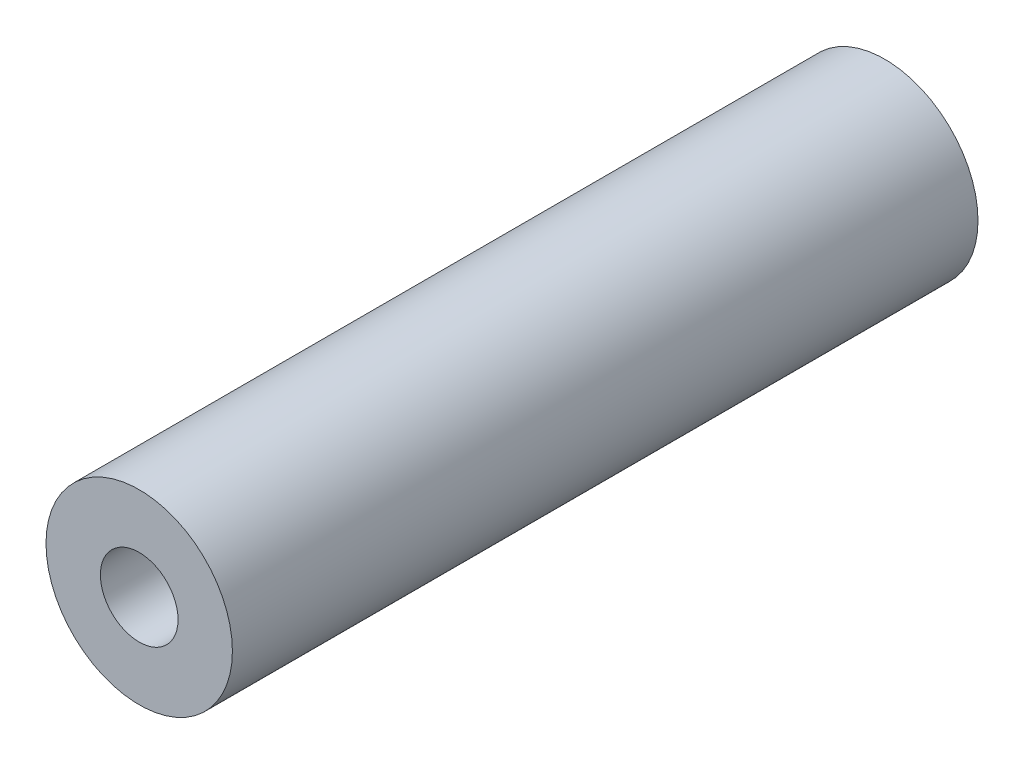
ISO-10303-21;
HEADER;
FILE_DESCRIPTION(('STEP AP214'),'2;1');
FILE_NAME('part.step','',(''),(''),'','','');
FILE_SCHEMA(('AUTOMOTIVE_DESIGN { 1 0 10303 214 1 1 1 1 }'));
ENDSEC;
DATA;
#1=APPLICATION_CONTEXT('core data for automotive mechanical design processes');
#2=APPLICATION_PROTOCOL_DEFINITION('international standard','automotive_design',2000,#1);
#3=PRODUCT_CONTEXT('',#1,'mechanical');
#4=PRODUCT('Part','Part','',(#3));
#5=PRODUCT_RELATED_PRODUCT_CATEGORY('part','',(#4));
#6=PRODUCT_DEFINITION_FORMATION('','',#4);
#7=PRODUCT_DEFINITION_CONTEXT('part definition',#1,'design');
#8=PRODUCT_DEFINITION('design','',#6,#7);
#9=PRODUCT_DEFINITION_SHAPE('','',#8);
#10=(LENGTH_UNIT() NAMED_UNIT(*) SI_UNIT(.MILLI.,.METRE.));
#11=(NAMED_UNIT(*) PLANE_ANGLE_UNIT() SI_UNIT($,.RADIAN.));
#12=(NAMED_UNIT(*) SI_UNIT($,.STERADIAN.) SOLID_ANGLE_UNIT());
#13=UNCERTAINTY_MEASURE_WITH_UNIT(LENGTH_MEASURE(1.E-05),#10,'distance_accuracy_value','');
#14=(GEOMETRIC_REPRESENTATION_CONTEXT(3) GLOBAL_UNCERTAINTY_ASSIGNED_CONTEXT((#13)) GLOBAL_UNIT_ASSIGNED_CONTEXT((#10,
#11,#12)) REPRESENTATION_CONTEXT('',''));
#15=CARTESIAN_POINT('',(0.,0.,0.));
#16=DIRECTION('',(0.,0.,1.));
#17=DIRECTION('',(1.,0.,0.));
#18=AXIS2_PLACEMENT_3D('',#15,#16,#17);
#19=CARTESIAN_POINT('',(0.,0.,24.));
#20=DIRECTION('',(0.,0.,1.));
#21=DIRECTION('',(1.,0.,0.));
#22=AXIS2_PLACEMENT_3D('',#19,#20,#21);
#23=PLANE('',#22);
#24=CARTESIAN_POINT('',(0.,0.,24.));
#25=DIRECTION('',(0.,0.,1.));
#26=DIRECTION('',(1.,0.,0.));
#27=AXIS2_PLACEMENT_3D('',#24,#25,#26);
#28=CIRCLE('',#27,3.);
#29=CARTESIAN_POINT('',(3.,0.,24.));
#30=VERTEX_POINT('',#29);
#31=EDGE_CURVE('E10',#30,#30,#28,.T.);
#32=ORIENTED_EDGE('',*,*,#31,.T.);
#33=EDGE_LOOP('',(#32));
#34=FACE_BOUND('',#33,.T.);
#35=CARTESIAN_POINT('',(0.,0.,24.));
#36=DIRECTION('',(0.,0.,1.));
#37=DIRECTION('',(1.,0.,0.));
#38=AXIS2_PLACEMENT_3D('',#35,#36,#37);
#39=CIRCLE('',#38,1.25);
#40=CARTESIAN_POINT('',(1.25,0.,24.));
#41=VERTEX_POINT('',#40);
#42=EDGE_CURVE('E43',#41,#41,#39,.T.);
#43=ORIENTED_EDGE('',*,*,#42,.F.);
#44=EDGE_LOOP('',(#43));
#45=FACE_BOUND('',#44,.T.);
#46=ADVANCED_FACE('F32',(#34,#45),#23,.T.);
#47=CARTESIAN_POINT('',(0.,0.,0.));
#48=DIRECTION('',(0.,0.,1.));
#49=DIRECTION('',(1.,0.,0.));
#50=AXIS2_PLACEMENT_3D('',#47,#48,#49);
#51=PLANE('',#50);
#52=CARTESIAN_POINT('',(0.,0.,0.));
#53=DIRECTION('',(0.,0.,1.));
#54=DIRECTION('',(1.,0.,0.));
#55=AXIS2_PLACEMENT_3D('',#52,#53,#54);
#56=CIRCLE('',#55,3.);
#57=CARTESIAN_POINT('',(3.,0.,0.));
#58=VERTEX_POINT('',#57);
#59=EDGE_CURVE('E36',#58,#58,#56,.T.);
#60=ORIENTED_EDGE('',*,*,#59,.F.);
#61=EDGE_LOOP('',(#60));
#62=FACE_BOUND('',#61,.T.);
#63=CARTESIAN_POINT('',(0.,0.,0.));
#64=DIRECTION('',(0.,0.,1.));
#65=DIRECTION('',(1.,0.,0.));
#66=AXIS2_PLACEMENT_3D('',#63,#64,#65);
#67=CIRCLE('',#66,1.25);
#68=CARTESIAN_POINT('',(1.25,0.,0.));
#69=VERTEX_POINT('',#68);
#70=EDGE_CURVE('E45',#69,#69,#67,.T.);
#71=ORIENTED_EDGE('',*,*,#70,.T.);
#72=EDGE_LOOP('',(#71));
#73=FACE_BOUND('',#72,.T.);
#74=ADVANCED_FACE('F55',(#62,#73),#51,.F.);
#75=CARTESIAN_POINT('',(0.,0.,24.));
#76=DIRECTION('',(0.,0.,-1.));
#77=DIRECTION('',(-1.,0.,0.));
#78=AXIS2_PLACEMENT_3D('',#75,#76,#77);
#79=CYLINDRICAL_SURFACE('',#78,3.);
#80=ORIENTED_EDGE('',*,*,#31,.F.);
#81=EDGE_LOOP('',(#80));
#82=FACE_BOUND('',#81,.T.);
#83=ORIENTED_EDGE('',*,*,#59,.T.);
#84=EDGE_LOOP('',(#83));
#85=FACE_BOUND('',#84,.T.);
#86=ADVANCED_FACE('F34',(#82,#85),#79,.T.);
#87=CARTESIAN_POINT('',(0.,0.,24.));
#88=DIRECTION('',(0.,0.,-1.));
#89=DIRECTION('',(-1.,0.,0.));
#90=AXIS2_PLACEMENT_3D('',#87,#88,#89);
#91=CYLINDRICAL_SURFACE('',#90,1.25);
#92=ORIENTED_EDGE('',*,*,#42,.T.);
#93=EDGE_LOOP('',(#92));
#94=FACE_BOUND('',#93,.T.);
#95=ORIENTED_EDGE('',*,*,#70,.F.);
#96=EDGE_LOOP('',(#95));
#97=FACE_BOUND('',#96,.T.);
#98=ADVANCED_FACE('F51',(#94,#97),#91,.F.);
#99=CLOSED_SHELL('',(#46,#74,#86,#98));
#100=MANIFOLD_SOLID_BREP('B2',#99);
#101=ADVANCED_BREP_SHAPE_REPRESENTATION('',(#18,#100),#14);
#102=SHAPE_DEFINITION_REPRESENTATION(#9,#101);
ENDSEC;
END-ISO-10303-21;
